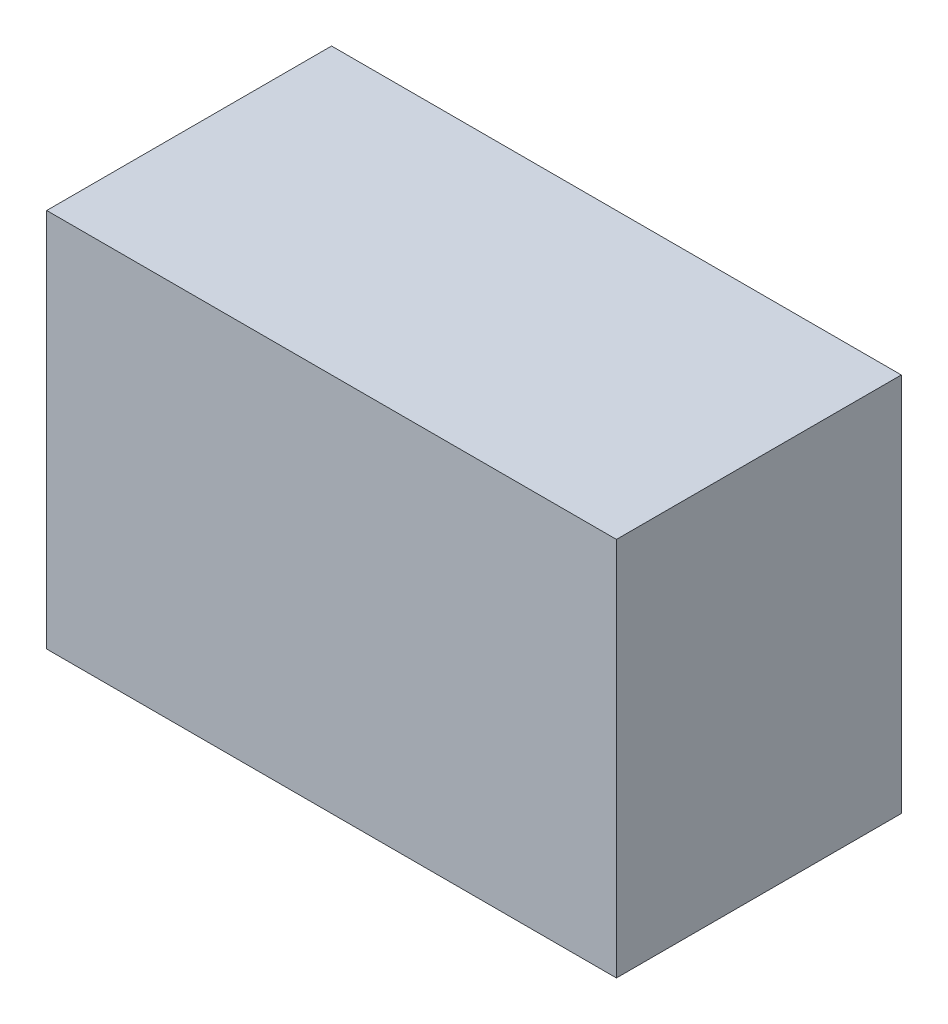
ISO-10303-21;
HEADER;
FILE_DESCRIPTION(('STEP AP214'),'2;1');
FILE_NAME('part.step','',(''),(''),'','','');
FILE_SCHEMA(('AUTOMOTIVE_DESIGN { 1 0 10303 214 1 1 1 1 }'));
ENDSEC;
DATA;
#1=APPLICATION_CONTEXT('core data for automotive mechanical design processes');
#2=APPLICATION_PROTOCOL_DEFINITION('international standard','automotive_design',2000,#1);
#3=PRODUCT_CONTEXT('',#1,'mechanical');
#4=PRODUCT('Part','Part','',(#3));
#5=PRODUCT_RELATED_PRODUCT_CATEGORY('part','',(#4));
#6=PRODUCT_DEFINITION_FORMATION('','',#4);
#7=PRODUCT_DEFINITION_CONTEXT('part definition',#1,'design');
#8=PRODUCT_DEFINITION('design','',#6,#7);
#9=PRODUCT_DEFINITION_SHAPE('','',#8);
#10=(LENGTH_UNIT() NAMED_UNIT(*) SI_UNIT(.MILLI.,.METRE.));
#11=(NAMED_UNIT(*) PLANE_ANGLE_UNIT() SI_UNIT($,.RADIAN.));
#12=(NAMED_UNIT(*) SI_UNIT($,.STERADIAN.) SOLID_ANGLE_UNIT());
#13=UNCERTAINTY_MEASURE_WITH_UNIT(LENGTH_MEASURE(1.E-05),#10,'distance_accuracy_value','');
#14=(GEOMETRIC_REPRESENTATION_CONTEXT(3) GLOBAL_UNCERTAINTY_ASSIGNED_CONTEXT((#13)) GLOBAL_UNIT_ASSIGNED_CONTEXT((#10,
#11,#12)) REPRESENTATION_CONTEXT('',''));
#15=CARTESIAN_POINT('',(0.,0.,0.));
#16=DIRECTION('',(0.,0.,1.));
#17=DIRECTION('',(1.,0.,0.));
#18=AXIS2_PLACEMENT_3D('',#15,#16,#17);
#19=CARTESIAN_POINT('',(0.,0.,15.));
#20=DIRECTION('',(1.,0.,0.));
#21=DIRECTION('',(0.,0.,-1.));
#22=AXIS2_PLACEMENT_3D('',#19,#20,#21);
#23=PLANE('',#22);
#24=DIRECTION('',(0.,-1.,0.));
#25=VECTOR('',#24,1.);
#26=CARTESIAN_POINT('',(0.,0.,0.));
#27=LINE('',#26,#25);
#28=CARTESIAN_POINT('',(0.,20.,0.));
#29=VERTEX_POINT('',#28);
#30=CARTESIAN_POINT('',(0.,0.,0.));
#31=VERTEX_POINT('',#30);
#32=EDGE_CURVE('E79',#29,#31,#27,.T.);
#33=ORIENTED_EDGE('',*,*,#32,.T.);
#34=DIRECTION('',(0.,0.,-1.));
#35=VECTOR('',#34,1.);
#36=CARTESIAN_POINT('',(0.,0.,15.));
#37=LINE('',#36,#35);
#38=CARTESIAN_POINT('',(0.,0.,15.));
#39=VERTEX_POINT('',#38);
#40=EDGE_CURVE('E11',#39,#31,#37,.T.);
#41=ORIENTED_EDGE('',*,*,#40,.F.);
#42=DIRECTION('',(0.,-1.,0.));
#43=VECTOR('',#42,1.);
#44=CARTESIAN_POINT('',(0.,0.,15.));
#45=LINE('',#44,#43);
#46=CARTESIAN_POINT('',(0.,20.,15.));
#47=VERTEX_POINT('',#46);
#48=EDGE_CURVE('E97',#47,#39,#45,.T.);
#49=ORIENTED_EDGE('',*,*,#48,.F.);
#50=DIRECTION('',(0.,0.,-1.));
#51=VECTOR('',#50,1.);
#52=CARTESIAN_POINT('',(0.,20.,15.));
#53=LINE('',#52,#51);
#54=EDGE_CURVE('E91',#47,#29,#53,.T.);
#55=ORIENTED_EDGE('',*,*,#54,.T.);
#56=EDGE_LOOP('',(#33,#41,#49,#55));
#57=FACE_BOUND('',#56,.T.);
#58=ADVANCED_FACE('F35',(#57),#23,.F.);
#59=CARTESIAN_POINT('',(0.,0.,15.));
#60=DIRECTION('',(0.,1.,0.));
#61=DIRECTION('',(0.,0.,1.));
#62=AXIS2_PLACEMENT_3D('',#59,#60,#61);
#63=PLANE('',#62);
#64=DIRECTION('',(1.,0.,0.));
#65=VECTOR('',#64,1.);
#66=CARTESIAN_POINT('',(0.,0.,0.));
#67=LINE('',#66,#65);
#68=CARTESIAN_POINT('',(30.,0.,0.));
#69=VERTEX_POINT('',#68);
#70=EDGE_CURVE('E75',#31,#69,#67,.T.);
#71=ORIENTED_EDGE('',*,*,#70,.T.);
#72=DIRECTION('',(0.,0.,-1.));
#73=VECTOR('',#72,1.);
#74=CARTESIAN_POINT('',(30.,0.,15.));
#75=LINE('',#74,#73);
#76=CARTESIAN_POINT('',(30.,0.,15.));
#77=VERTEX_POINT('',#76);
#78=EDGE_CURVE('E42',#77,#69,#75,.T.);
#79=ORIENTED_EDGE('',*,*,#78,.F.);
#80=DIRECTION('',(1.,0.,0.));
#81=VECTOR('',#80,1.);
#82=CARTESIAN_POINT('',(0.,0.,15.));
#83=LINE('',#82,#81);
#84=EDGE_CURVE('E87',#39,#77,#83,.T.);
#85=ORIENTED_EDGE('',*,*,#84,.F.);
#86=ORIENTED_EDGE('',*,*,#40,.T.);
#87=EDGE_LOOP('',(#71,#79,#85,#86));
#88=FACE_BOUND('',#87,.T.);
#89=ADVANCED_FACE('F86',(#88),#63,.F.);
#90=CARTESIAN_POINT('',(30.,0.,15.));
#91=DIRECTION('',(-1.,0.,0.));
#92=DIRECTION('',(0.,0.,1.));
#93=AXIS2_PLACEMENT_3D('',#90,#91,#92);
#94=PLANE('',#93);
#95=DIRECTION('',(0.,1.,0.));
#96=VECTOR('',#95,1.);
#97=CARTESIAN_POINT('',(30.,0.,0.));
#98=LINE('',#97,#96);
#99=CARTESIAN_POINT('',(30.,20.,0.));
#100=VERTEX_POINT('',#99);
#101=EDGE_CURVE('E80',#69,#100,#98,.T.);
#102=ORIENTED_EDGE('',*,*,#101,.T.);
#103=DIRECTION('',(0.,0.,-1.));
#104=VECTOR('',#103,1.);
#105=CARTESIAN_POINT('',(30.,20.,15.));
#106=LINE('',#105,#104);
#107=CARTESIAN_POINT('',(30.,20.,15.));
#108=VERTEX_POINT('',#107);
#109=EDGE_CURVE('E103',#108,#100,#106,.T.);
#110=ORIENTED_EDGE('',*,*,#109,.F.);
#111=DIRECTION('',(0.,1.,0.));
#112=VECTOR('',#111,1.);
#113=CARTESIAN_POINT('',(30.,0.,15.));
#114=LINE('',#113,#112);
#115=EDGE_CURVE('E54',#77,#108,#114,.T.);
#116=ORIENTED_EDGE('',*,*,#115,.F.);
#117=ORIENTED_EDGE('',*,*,#78,.T.);
#118=EDGE_LOOP('',(#102,#110,#116,#117));
#119=FACE_BOUND('',#118,.T.);
#120=ADVANCED_FACE('F106',(#119),#94,.F.);
#121=CARTESIAN_POINT('',(0.,20.,15.));
#122=DIRECTION('',(0.,-1.,0.));
#123=DIRECTION('',(0.,0.,-1.));
#124=AXIS2_PLACEMENT_3D('',#121,#122,#123);
#125=PLANE('',#124);
#126=DIRECTION('',(-1.,0.,0.));
#127=VECTOR('',#126,1.);
#128=CARTESIAN_POINT('',(0.,20.,0.));
#129=LINE('',#128,#127);
#130=EDGE_CURVE('E95',#100,#29,#129,.T.);
#131=ORIENTED_EDGE('',*,*,#130,.T.);
#132=ORIENTED_EDGE('',*,*,#54,.F.);
#133=DIRECTION('',(-1.,0.,0.));
#134=VECTOR('',#133,1.);
#135=CARTESIAN_POINT('',(0.,20.,15.));
#136=LINE('',#135,#134);
#137=EDGE_CURVE('E49',#108,#47,#136,.T.);
#138=ORIENTED_EDGE('',*,*,#137,.F.);
#139=ORIENTED_EDGE('',*,*,#109,.T.);
#140=EDGE_LOOP('',(#131,#132,#138,#139));
#141=FACE_BOUND('',#140,.T.);
#142=ADVANCED_FACE('F108',(#141),#125,.F.);
#143=CARTESIAN_POINT('',(0.,20.,15.));
#144=DIRECTION('',(0.,0.,-1.));
#145=DIRECTION('',(-1.,0.,0.));
#146=AXIS2_PLACEMENT_3D('',#143,#144,#145);
#147=PLANE('',#146);
#148=ORIENTED_EDGE('',*,*,#48,.T.);
#149=ORIENTED_EDGE('',*,*,#84,.T.);
#150=ORIENTED_EDGE('',*,*,#115,.T.);
#151=ORIENTED_EDGE('',*,*,#137,.T.);
#152=EDGE_LOOP('',(#148,#149,#150,#151));
#153=FACE_BOUND('',#152,.T.);
#154=ADVANCED_FACE('F109',(#153),#147,.F.);
#155=CARTESIAN_POINT('',(0.,20.,0.));
#156=DIRECTION('',(0.,0.,-1.));
#157=DIRECTION('',(-1.,0.,0.));
#158=AXIS2_PLACEMENT_3D('',#155,#156,#157);
#159=PLANE('',#158);
#160=ORIENTED_EDGE('',*,*,#32,.F.);
#161=ORIENTED_EDGE('',*,*,#130,.F.);
#162=ORIENTED_EDGE('',*,*,#101,.F.);
#163=ORIENTED_EDGE('',*,*,#70,.F.);
#164=EDGE_LOOP('',(#160,#161,#162,#163));
#165=FACE_BOUND('',#164,.T.);
#166=ADVANCED_FACE('F76',(#165),#159,.T.);
#167=CLOSED_SHELL('',(#58,#89,#120,#142,#154,#166));
#168=MANIFOLD_SOLID_BREP('B2',#167);
#169=ADVANCED_BREP_SHAPE_REPRESENTATION('',(#18,#168),#14);
#170=SHAPE_DEFINITION_REPRESENTATION(#9,#169);
ENDSEC;
END-ISO-10303-21;
